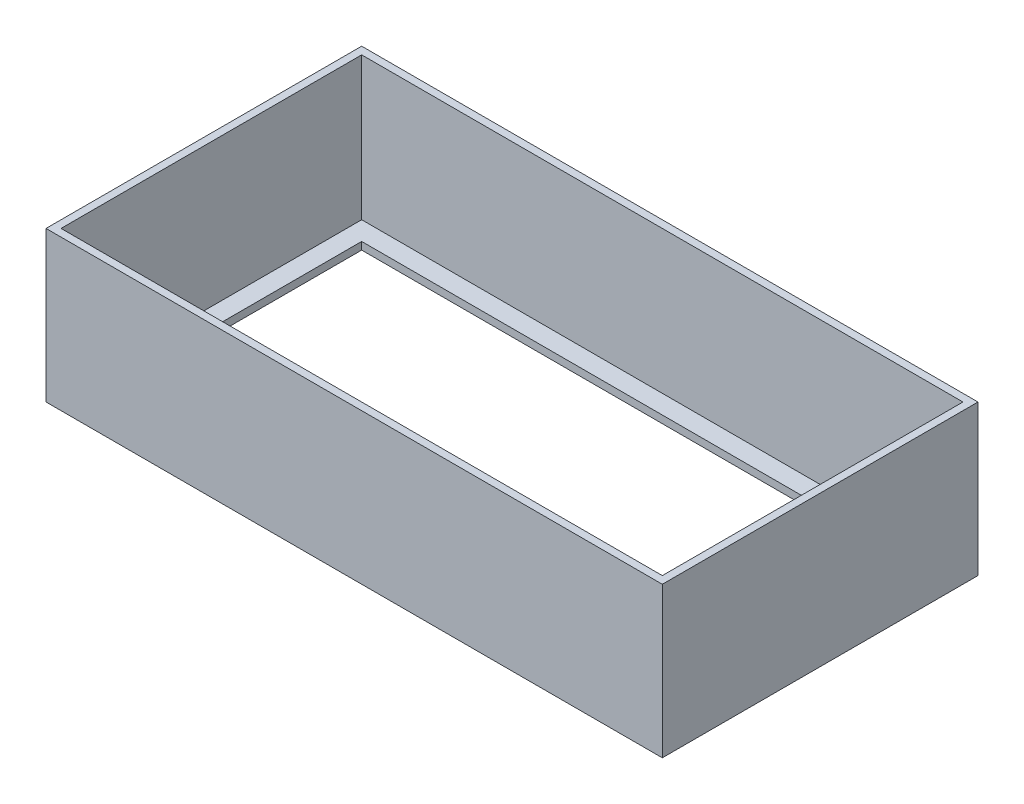
ISO-10303-21;
HEADER;
FILE_DESCRIPTION(('STEP AP214'),'2;1');
FILE_NAME('part.step','',(''),(''),'','','');
FILE_SCHEMA(('AUTOMOTIVE_DESIGN { 1 0 10303 214 1 1 1 1 }'));
ENDSEC;
DATA;
#1=APPLICATION_CONTEXT('core data for automotive mechanical design processes');
#2=APPLICATION_PROTOCOL_DEFINITION('international standard','automotive_design',2000,#1);
#3=PRODUCT_CONTEXT('',#1,'mechanical');
#4=PRODUCT('Part','Part','',(#3));
#5=PRODUCT_RELATED_PRODUCT_CATEGORY('part','',(#4));
#6=PRODUCT_DEFINITION_FORMATION('','',#4);
#7=PRODUCT_DEFINITION_CONTEXT('part definition',#1,'design');
#8=PRODUCT_DEFINITION('design','',#6,#7);
#9=PRODUCT_DEFINITION_SHAPE('','',#8);
#10=(LENGTH_UNIT() NAMED_UNIT(*) SI_UNIT(.MILLI.,.METRE.));
#11=(NAMED_UNIT(*) PLANE_ANGLE_UNIT() SI_UNIT($,.RADIAN.));
#12=(NAMED_UNIT(*) SI_UNIT($,.STERADIAN.) SOLID_ANGLE_UNIT());
#13=UNCERTAINTY_MEASURE_WITH_UNIT(LENGTH_MEASURE(1.E-05),#10,'distance_accuracy_value','');
#14=(GEOMETRIC_REPRESENTATION_CONTEXT(3) GLOBAL_UNCERTAINTY_ASSIGNED_CONTEXT((#13)) GLOBAL_UNIT_ASSIGNED_CONTEXT((#10,
#11,#12)) REPRESENTATION_CONTEXT('',''));
#15=CARTESIAN_POINT('',(0.,0.,0.));
#16=DIRECTION('',(0.,0.,1.));
#17=DIRECTION('',(1.,0.,0.));
#18=AXIS2_PLACEMENT_3D('',#15,#16,#17);
#19=CARTESIAN_POINT('',(0.,2.,0.));
#20=DIRECTION('',(0.,-1.,0.));
#21=DIRECTION('',(0.,0.,-1.));
#22=AXIS2_PLACEMENT_3D('',#19,#20,#21);
#23=PLANE('',#22);
#24=DIRECTION('',(0.,0.,1.));
#25=VECTOR('',#24,1.);
#26=CARTESIAN_POINT('',(2.,2.,0.));
#27=LINE('',#26,#25);
#28=CARTESIAN_POINT('',(2.,2.,-82.));
#29=VERTEX_POINT('',#28);
#30=CARTESIAN_POINT('',(2.,2.,-2.));
#31=VERTEX_POINT('',#30);
#32=EDGE_CURVE('E171',#29,#31,#27,.T.);
#33=ORIENTED_EDGE('',*,*,#32,.T.);
#34=DIRECTION('',(1.,0.,0.));
#35=VECTOR('',#34,1.);
#36=CARTESIAN_POINT('',(0.,2.,-2.));
#37=LINE('',#36,#35);
#38=CARTESIAN_POINT('',(162.,2.,-2.));
#39=VERTEX_POINT('',#38);
#40=EDGE_CURVE('E175',#31,#39,#37,.T.);
#41=ORIENTED_EDGE('',*,*,#40,.T.);
#42=DIRECTION('',(0.,0.,-1.));
#43=VECTOR('',#42,1.);
#44=CARTESIAN_POINT('',(162.,2.,0.));
#45=LINE('',#44,#43);
#46=CARTESIAN_POINT('',(162.,2.,-82.));
#47=VERTEX_POINT('',#46);
#48=EDGE_CURVE('E190',#39,#47,#45,.T.);
#49=ORIENTED_EDGE('',*,*,#48,.T.);
#50=DIRECTION('',(-1.,0.,0.));
#51=VECTOR('',#50,1.);
#52=CARTESIAN_POINT('',(0.,2.,-82.));
#53=LINE('',#52,#51);
#54=EDGE_CURVE('E196',#47,#29,#53,.T.);
#55=ORIENTED_EDGE('',*,*,#54,.T.);
#56=EDGE_LOOP('',(#33,#41,#49,#55));
#57=FACE_BOUND('',#56,.T.);
#58=DIRECTION('',(-1.,0.,0.));
#59=VECTOR('',#58,1.);
#60=CARTESIAN_POINT('',(157.,2.,-77.));
#61=LINE('',#60,#59);
#62=CARTESIAN_POINT('',(157.,2.,-77.));
#63=VERTEX_POINT('',#62);
#64=CARTESIAN_POINT('',(7.,2.,-77.));
#65=VERTEX_POINT('',#64);
#66=EDGE_CURVE('E157',#63,#65,#61,.T.);
#67=ORIENTED_EDGE('',*,*,#66,.F.);
#68=DIRECTION('',(0.,0.,-1.));
#69=VECTOR('',#68,1.);
#70=CARTESIAN_POINT('',(157.,2.,-7.));
#71=LINE('',#70,#69);
#72=CARTESIAN_POINT('',(157.,2.,-7.));
#73=VERTEX_POINT('',#72);
#74=EDGE_CURVE('E150',#73,#63,#71,.T.);
#75=ORIENTED_EDGE('',*,*,#74,.F.);
#76=DIRECTION('',(1.,0.,0.));
#77=VECTOR('',#76,1.);
#78=CARTESIAN_POINT('',(7.,2.,-7.));
#79=LINE('',#78,#77);
#80=CARTESIAN_POINT('',(7.,2.,-7.));
#81=VERTEX_POINT('',#80);
#82=EDGE_CURVE('E54',#81,#73,#79,.T.);
#83=ORIENTED_EDGE('',*,*,#82,.F.);
#84=DIRECTION('',(0.,0.,1.));
#85=VECTOR('',#84,1.);
#86=CARTESIAN_POINT('',(7.,2.,-77.));
#87=LINE('',#86,#85);
#88=EDGE_CURVE('E143',#65,#81,#87,.T.);
#89=ORIENTED_EDGE('',*,*,#88,.F.);
#90=EDGE_LOOP('',(#67,#75,#83,#89));
#91=FACE_BOUND('',#90,.T.);
#92=ADVANCED_FACE('F38',(#57,#91),#23,.F.);
#93=CARTESIAN_POINT('',(0.,40.,0.));
#94=DIRECTION('',(0.,-1.,0.));
#95=DIRECTION('',(0.,0.,-1.));
#96=AXIS2_PLACEMENT_3D('',#93,#94,#95);
#97=PLANE('',#96);
#98=DIRECTION('',(0.,0.,1.));
#99=VECTOR('',#98,1.);
#100=CARTESIAN_POINT('',(0.,40.,0.));
#101=LINE('',#100,#99);
#102=CARTESIAN_POINT('',(0.,40.,-84.));
#103=VERTEX_POINT('',#102);
#104=CARTESIAN_POINT('',(0.,40.,0.));
#105=VERTEX_POINT('',#104);
#106=EDGE_CURVE('E214',#103,#105,#101,.T.);
#107=ORIENTED_EDGE('',*,*,#106,.T.);
#108=DIRECTION('',(1.,0.,0.));
#109=VECTOR('',#108,1.);
#110=CARTESIAN_POINT('',(0.,40.,0.));
#111=LINE('',#110,#109);
#112=CARTESIAN_POINT('',(164.,40.,0.));
#113=VERTEX_POINT('',#112);
#114=EDGE_CURVE('E218',#105,#113,#111,.T.);
#115=ORIENTED_EDGE('',*,*,#114,.T.);
#116=DIRECTION('',(0.,0.,-1.));
#117=VECTOR('',#116,1.);
#118=CARTESIAN_POINT('',(164.,40.,0.));
#119=LINE('',#118,#117);
#120=CARTESIAN_POINT('',(164.,40.,-84.));
#121=VERTEX_POINT('',#120);
#122=EDGE_CURVE('E222',#113,#121,#119,.T.);
#123=ORIENTED_EDGE('',*,*,#122,.T.);
#124=DIRECTION('',(-1.,0.,0.));
#125=VECTOR('',#124,1.);
#126=CARTESIAN_POINT('',(0.,40.,-84.));
#127=LINE('',#126,#125);
#128=EDGE_CURVE('E225',#121,#103,#127,.T.);
#129=ORIENTED_EDGE('',*,*,#128,.T.);
#130=EDGE_LOOP('',(#107,#115,#123,#129));
#131=FACE_BOUND('',#130,.T.);
#132=DIRECTION('',(0.,0.,1.));
#133=VECTOR('',#132,1.);
#134=CARTESIAN_POINT('',(2.,40.,0.));
#135=LINE('',#134,#133);
#136=CARTESIAN_POINT('',(2.,40.,-82.));
#137=VERTEX_POINT('',#136);
#138=CARTESIAN_POINT('',(2.,40.,-2.));
#139=VERTEX_POINT('',#138);
#140=EDGE_CURVE('E202',#137,#139,#135,.T.);
#141=ORIENTED_EDGE('',*,*,#140,.F.);
#142=DIRECTION('',(-1.,0.,0.));
#143=VECTOR('',#142,1.);
#144=CARTESIAN_POINT('',(0.,40.,-82.));
#145=LINE('',#144,#143);
#146=CARTESIAN_POINT('',(162.,40.,-82.));
#147=VERTEX_POINT('',#146);
#148=EDGE_CURVE('E187',#147,#137,#145,.T.);
#149=ORIENTED_EDGE('',*,*,#148,.F.);
#150=DIRECTION('',(0.,0.,-1.));
#151=VECTOR('',#150,1.);
#152=CARTESIAN_POINT('',(162.,40.,0.));
#153=LINE('',#152,#151);
#154=CARTESIAN_POINT('',(162.,40.,-2.));
#155=VERTEX_POINT('',#154);
#156=EDGE_CURVE('E208',#155,#147,#153,.T.);
#157=ORIENTED_EDGE('',*,*,#156,.F.);
#158=DIRECTION('',(1.,0.,0.));
#159=VECTOR('',#158,1.);
#160=CARTESIAN_POINT('',(0.,40.,-2.));
#161=LINE('',#160,#159);
#162=EDGE_CURVE('E205',#139,#155,#161,.T.);
#163=ORIENTED_EDGE('',*,*,#162,.F.);
#164=EDGE_LOOP('',(#141,#149,#157,#163));
#165=FACE_BOUND('',#164,.T.);
#166=ADVANCED_FACE('F265',(#131,#165),#97,.F.);
#167=CARTESIAN_POINT('',(0.,40.,0.));
#168=DIRECTION('',(1.,0.,0.));
#169=DIRECTION('',(0.,0.,-1.));
#170=AXIS2_PLACEMENT_3D('',#167,#168,#169);
#171=PLANE('',#170);
#172=DIRECTION('',(0.,0.,1.));
#173=VECTOR('',#172,1.);
#174=CARTESIAN_POINT('',(0.,0.,0.));
#175=LINE('',#174,#173);
#176=CARTESIAN_POINT('',(0.,0.,-84.));
#177=VERTEX_POINT('',#176);
#178=CARTESIAN_POINT('',(0.,0.,0.));
#179=VERTEX_POINT('',#178);
#180=EDGE_CURVE('E180',#177,#179,#175,.T.);
#181=ORIENTED_EDGE('',*,*,#180,.T.);
#182=DIRECTION('',(0.,-1.,0.));
#183=VECTOR('',#182,1.);
#184=CARTESIAN_POINT('',(0.,40.,0.));
#185=LINE('',#184,#183);
#186=EDGE_CURVE('E11',#105,#179,#185,.T.);
#187=ORIENTED_EDGE('',*,*,#186,.F.);
#188=ORIENTED_EDGE('',*,*,#106,.F.);
#189=DIRECTION('',(0.,-1.,0.));
#190=VECTOR('',#189,1.);
#191=CARTESIAN_POINT('',(0.,40.,-84.));
#192=LINE('',#191,#190);
#193=EDGE_CURVE('E228',#103,#177,#192,.T.);
#194=ORIENTED_EDGE('',*,*,#193,.T.);
#195=EDGE_LOOP('',(#181,#187,#188,#194));
#196=FACE_BOUND('',#195,.T.);
#197=ADVANCED_FACE('F40',(#196),#171,.F.);
#198=CARTESIAN_POINT('',(0.,40.,0.));
#199=DIRECTION('',(0.,0.,-1.));
#200=DIRECTION('',(-1.,0.,0.));
#201=AXIS2_PLACEMENT_3D('',#198,#199,#200);
#202=PLANE('',#201);
#203=DIRECTION('',(1.,0.,0.));
#204=VECTOR('',#203,1.);
#205=CARTESIAN_POINT('',(0.,0.,0.));
#206=LINE('',#205,#204);
#207=CARTESIAN_POINT('',(164.,0.,0.));
#208=VERTEX_POINT('',#207);
#209=EDGE_CURVE('E232',#179,#208,#206,.T.);
#210=ORIENTED_EDGE('',*,*,#209,.T.);
#211=DIRECTION('',(0.,-1.,0.));
#212=VECTOR('',#211,1.);
#213=CARTESIAN_POINT('',(164.,40.,0.));
#214=LINE('',#213,#212);
#215=EDGE_CURVE('E47',#113,#208,#214,.T.);
#216=ORIENTED_EDGE('',*,*,#215,.F.);
#217=ORIENTED_EDGE('',*,*,#114,.F.);
#218=ORIENTED_EDGE('',*,*,#186,.T.);
#219=EDGE_LOOP('',(#210,#216,#217,#218));
#220=FACE_BOUND('',#219,.T.);
#221=ADVANCED_FACE('F267',(#220),#202,.F.);
#222=CARTESIAN_POINT('',(164.,40.,0.));
#223=DIRECTION('',(-1.,0.,0.));
#224=DIRECTION('',(0.,0.,1.));
#225=AXIS2_PLACEMENT_3D('',#222,#223,#224);
#226=PLANE('',#225);
#227=DIRECTION('',(0.,0.,-1.));
#228=VECTOR('',#227,1.);
#229=CARTESIAN_POINT('',(164.,0.,0.));
#230=LINE('',#229,#228);
#231=CARTESIAN_POINT('',(164.,0.,-84.));
#232=VERTEX_POINT('',#231);
#233=EDGE_CURVE('E235',#208,#232,#230,.T.);
#234=ORIENTED_EDGE('',*,*,#233,.T.);
#235=DIRECTION('',(0.,-1.,0.));
#236=VECTOR('',#235,1.);
#237=CARTESIAN_POINT('',(164.,40.,-84.));
#238=LINE('',#237,#236);
#239=EDGE_CURVE('E243',#121,#232,#238,.T.);
#240=ORIENTED_EDGE('',*,*,#239,.F.);
#241=ORIENTED_EDGE('',*,*,#122,.F.);
#242=ORIENTED_EDGE('',*,*,#215,.T.);
#243=EDGE_LOOP('',(#234,#240,#241,#242));
#244=FACE_BOUND('',#243,.T.);
#245=ADVANCED_FACE('F252',(#244),#226,.F.);
#246=CARTESIAN_POINT('',(0.,40.,-84.));
#247=DIRECTION('',(0.,0.,1.));
#248=DIRECTION('',(1.,0.,0.));
#249=AXIS2_PLACEMENT_3D('',#246,#247,#248);
#250=PLANE('',#249);
#251=DIRECTION('',(-1.,0.,0.));
#252=VECTOR('',#251,1.);
#253=CARTESIAN_POINT('',(0.,0.,-84.));
#254=LINE('',#253,#252);
#255=EDGE_CURVE('E219',#232,#177,#254,.T.);
#256=ORIENTED_EDGE('',*,*,#255,.T.);
#257=ORIENTED_EDGE('',*,*,#193,.F.);
#258=ORIENTED_EDGE('',*,*,#128,.F.);
#259=ORIENTED_EDGE('',*,*,#239,.T.);
#260=EDGE_LOOP('',(#256,#257,#258,#259));
#261=FACE_BOUND('',#260,.T.);
#262=ADVANCED_FACE('F259',(#261),#250,.F.);
#263=CARTESIAN_POINT('',(0.,0.,0.));
#264=DIRECTION('',(0.,-1.,0.));
#265=DIRECTION('',(0.,0.,-1.));
#266=AXIS2_PLACEMENT_3D('',#263,#264,#265);
#267=PLANE('',#266);
#268=DIRECTION('',(0.,0.,1.));
#269=VECTOR('',#268,1.);
#270=CARTESIAN_POINT('',(7.,0.,-77.));
#271=LINE('',#270,#269);
#272=CARTESIAN_POINT('',(7.,0.,-77.));
#273=VERTEX_POINT('',#272);
#274=CARTESIAN_POINT('',(7.,0.,-7.));
#275=VERTEX_POINT('',#274);
#276=EDGE_CURVE('E140',#273,#275,#271,.T.);
#277=ORIENTED_EDGE('',*,*,#276,.T.);
#278=DIRECTION('',(1.,0.,0.));
#279=VECTOR('',#278,1.);
#280=CARTESIAN_POINT('',(7.,0.,-7.));
#281=LINE('',#280,#279);
#282=CARTESIAN_POINT('',(157.,0.,-7.));
#283=VERTEX_POINT('',#282);
#284=EDGE_CURVE('E127',#275,#283,#281,.T.);
#285=ORIENTED_EDGE('',*,*,#284,.T.);
#286=DIRECTION('',(0.,0.,-1.));
#287=VECTOR('',#286,1.);
#288=CARTESIAN_POINT('',(157.,0.,-7.));
#289=LINE('',#288,#287);
#290=CARTESIAN_POINT('',(157.,0.,-77.));
#291=VERTEX_POINT('',#290);
#292=EDGE_CURVE('E162',#283,#291,#289,.T.);
#293=ORIENTED_EDGE('',*,*,#292,.T.);
#294=DIRECTION('',(-1.,0.,0.));
#295=VECTOR('',#294,1.);
#296=CARTESIAN_POINT('',(157.,0.,-77.));
#297=LINE('',#296,#295);
#298=EDGE_CURVE('E148',#291,#273,#297,.T.);
#299=ORIENTED_EDGE('',*,*,#298,.T.);
#300=EDGE_LOOP('',(#277,#285,#293,#299));
#301=FACE_BOUND('',#300,.T.);
#302=ORIENTED_EDGE('',*,*,#180,.F.);
#303=ORIENTED_EDGE('',*,*,#255,.F.);
#304=ORIENTED_EDGE('',*,*,#233,.F.);
#305=ORIENTED_EDGE('',*,*,#209,.F.);
#306=EDGE_LOOP('',(#302,#303,#304,#305));
#307=FACE_BOUND('',#306,.T.);
#308=ADVANCED_FACE('F146',(#301,#307),#267,.T.);
#309=CARTESIAN_POINT('',(2.,40.,0.));
#310=DIRECTION('',(1.,0.,0.));
#311=DIRECTION('',(0.,0.,-1.));
#312=AXIS2_PLACEMENT_3D('',#309,#310,#311);
#313=PLANE('',#312);
#314=ORIENTED_EDGE('',*,*,#32,.F.);
#315=DIRECTION('',(0.,-1.,0.));
#316=VECTOR('',#315,1.);
#317=CARTESIAN_POINT('',(2.,40.,-82.));
#318=LINE('',#317,#316);
#319=EDGE_CURVE('E182',#137,#29,#318,.T.);
#320=ORIENTED_EDGE('',*,*,#319,.F.);
#321=ORIENTED_EDGE('',*,*,#140,.T.);
#322=DIRECTION('',(0.,-1.,0.));
#323=VECTOR('',#322,1.);
#324=CARTESIAN_POINT('',(2.,40.,-2.));
#325=LINE('',#324,#323);
#326=EDGE_CURVE('E176',#139,#31,#325,.T.);
#327=ORIENTED_EDGE('',*,*,#326,.T.);
#328=EDGE_LOOP('',(#314,#320,#321,#327));
#329=FACE_BOUND('',#328,.T.);
#330=ADVANCED_FACE('F289',(#329),#313,.T.);
#331=CARTESIAN_POINT('',(0.,40.,-2.));
#332=DIRECTION('',(0.,0.,-1.));
#333=DIRECTION('',(-1.,0.,0.));
#334=AXIS2_PLACEMENT_3D('',#331,#332,#333);
#335=PLANE('',#334);
#336=ORIENTED_EDGE('',*,*,#40,.F.);
#337=ORIENTED_EDGE('',*,*,#326,.F.);
#338=ORIENTED_EDGE('',*,*,#162,.T.);
#339=DIRECTION('',(0.,-1.,0.));
#340=VECTOR('',#339,1.);
#341=CARTESIAN_POINT('',(162.,40.,-2.));
#342=LINE('',#341,#340);
#343=EDGE_CURVE('E181',#155,#39,#342,.T.);
#344=ORIENTED_EDGE('',*,*,#343,.T.);
#345=EDGE_LOOP('',(#336,#337,#338,#344));
#346=FACE_BOUND('',#345,.T.);
#347=ADVANCED_FACE('F310',(#346),#335,.T.);
#348=CARTESIAN_POINT('',(162.,40.,0.));
#349=DIRECTION('',(-1.,0.,0.));
#350=DIRECTION('',(0.,0.,1.));
#351=AXIS2_PLACEMENT_3D('',#348,#349,#350);
#352=PLANE('',#351);
#353=ORIENTED_EDGE('',*,*,#48,.F.);
#354=ORIENTED_EDGE('',*,*,#343,.F.);
#355=ORIENTED_EDGE('',*,*,#156,.T.);
#356=DIRECTION('',(0.,-1.,0.));
#357=VECTOR('',#356,1.);
#358=CARTESIAN_POINT('',(162.,40.,-82.));
#359=LINE('',#358,#357);
#360=EDGE_CURVE('E186',#147,#47,#359,.T.);
#361=ORIENTED_EDGE('',*,*,#360,.T.);
#362=EDGE_LOOP('',(#353,#354,#355,#361));
#363=FACE_BOUND('',#362,.T.);
#364=ADVANCED_FACE('F318',(#363),#352,.T.);
#365=CARTESIAN_POINT('',(0.,40.,-82.));
#366=DIRECTION('',(0.,0.,1.));
#367=DIRECTION('',(1.,0.,0.));
#368=AXIS2_PLACEMENT_3D('',#365,#366,#367);
#369=PLANE('',#368);
#370=ORIENTED_EDGE('',*,*,#54,.F.);
#371=ORIENTED_EDGE('',*,*,#360,.F.);
#372=ORIENTED_EDGE('',*,*,#148,.T.);
#373=ORIENTED_EDGE('',*,*,#319,.T.);
#374=EDGE_LOOP('',(#370,#371,#372,#373));
#375=FACE_BOUND('',#374,.T.);
#376=ADVANCED_FACE('F285',(#375),#369,.T.);
#377=CARTESIAN_POINT('',(7.,-165.529453572468,-77.));
#378=DIRECTION('',(-1.,0.,0.));
#379=DIRECTION('',(0.,0.,1.));
#380=AXIS2_PLACEMENT_3D('',#377,#378,#379);
#381=PLANE('',#380);
#382=DIRECTION('',(0.,1.,0.));
#383=VECTOR('',#382,1.);
#384=CARTESIAN_POINT('',(7.,-165.529453572468,-77.));
#385=LINE('',#384,#383);
#386=EDGE_CURVE('E62',#273,#65,#385,.T.);
#387=ORIENTED_EDGE('',*,*,#386,.T.);
#388=ORIENTED_EDGE('',*,*,#88,.T.);
#389=DIRECTION('',(0.,1.,0.));
#390=VECTOR('',#389,1.);
#391=CARTESIAN_POINT('',(7.,-165.529453572468,-7.));
#392=LINE('',#391,#390);
#393=EDGE_CURVE('E130',#275,#81,#392,.T.);
#394=ORIENTED_EDGE('',*,*,#393,.F.);
#395=ORIENTED_EDGE('',*,*,#276,.F.);
#396=EDGE_LOOP('',(#387,#388,#394,#395));
#397=FACE_BOUND('',#396,.T.);
#398=ADVANCED_FACE('F139',(#397),#381,.F.);
#399=CARTESIAN_POINT('',(7.,-165.529453572468,-7.));
#400=DIRECTION('',(0.,0.,1.));
#401=DIRECTION('',(1.,0.,0.));
#402=AXIS2_PLACEMENT_3D('',#399,#400,#401);
#403=PLANE('',#402);
#404=ORIENTED_EDGE('',*,*,#393,.T.);
#405=ORIENTED_EDGE('',*,*,#82,.T.);
#406=DIRECTION('',(0.,1.,0.));
#407=VECTOR('',#406,1.);
#408=CARTESIAN_POINT('',(157.,-165.529453572468,-7.));
#409=LINE('',#408,#407);
#410=EDGE_CURVE('E132',#283,#73,#409,.T.);
#411=ORIENTED_EDGE('',*,*,#410,.F.);
#412=ORIENTED_EDGE('',*,*,#284,.F.);
#413=EDGE_LOOP('',(#404,#405,#411,#412));
#414=FACE_BOUND('',#413,.T.);
#415=ADVANCED_FACE('F129',(#414),#403,.F.);
#416=CARTESIAN_POINT('',(157.,-165.529453572468,-7.));
#417=DIRECTION('',(1.,0.,0.));
#418=DIRECTION('',(0.,0.,-1.));
#419=AXIS2_PLACEMENT_3D('',#416,#417,#418);
#420=PLANE('',#419);
#421=ORIENTED_EDGE('',*,*,#410,.T.);
#422=ORIENTED_EDGE('',*,*,#74,.T.);
#423=DIRECTION('',(0.,1.,0.));
#424=VECTOR('',#423,1.);
#425=CARTESIAN_POINT('',(157.,-165.529453572468,-77.));
#426=LINE('',#425,#424);
#427=EDGE_CURVE('E161',#291,#63,#426,.T.);
#428=ORIENTED_EDGE('',*,*,#427,.F.);
#429=ORIENTED_EDGE('',*,*,#292,.F.);
#430=EDGE_LOOP('',(#421,#422,#428,#429));
#431=FACE_BOUND('',#430,.T.);
#432=ADVANCED_FACE('F346',(#431),#420,.F.);
#433=CARTESIAN_POINT('',(157.,-165.529453572468,-77.));
#434=DIRECTION('',(0.,0.,-1.));
#435=DIRECTION('',(-1.,0.,0.));
#436=AXIS2_PLACEMENT_3D('',#433,#434,#435);
#437=PLANE('',#436);
#438=ORIENTED_EDGE('',*,*,#427,.T.);
#439=ORIENTED_EDGE('',*,*,#66,.T.);
#440=ORIENTED_EDGE('',*,*,#386,.F.);
#441=ORIENTED_EDGE('',*,*,#298,.F.);
#442=EDGE_LOOP('',(#438,#439,#440,#441));
#443=FACE_BOUND('',#442,.T.);
#444=ADVANCED_FACE('F353',(#443),#437,.F.);
#445=CLOSED_SHELL('',(#92,#166,#197,#221,#245,#262,#308,#330,#347,#364,#376,#398,#415,#432,#444));
#446=MANIFOLD_SOLID_BREP('B2',#445);
#447=ADVANCED_BREP_SHAPE_REPRESENTATION('',(#18,#446),#14);
#448=SHAPE_DEFINITION_REPRESENTATION(#9,#447);
ENDSEC;
END-ISO-10303-21;
